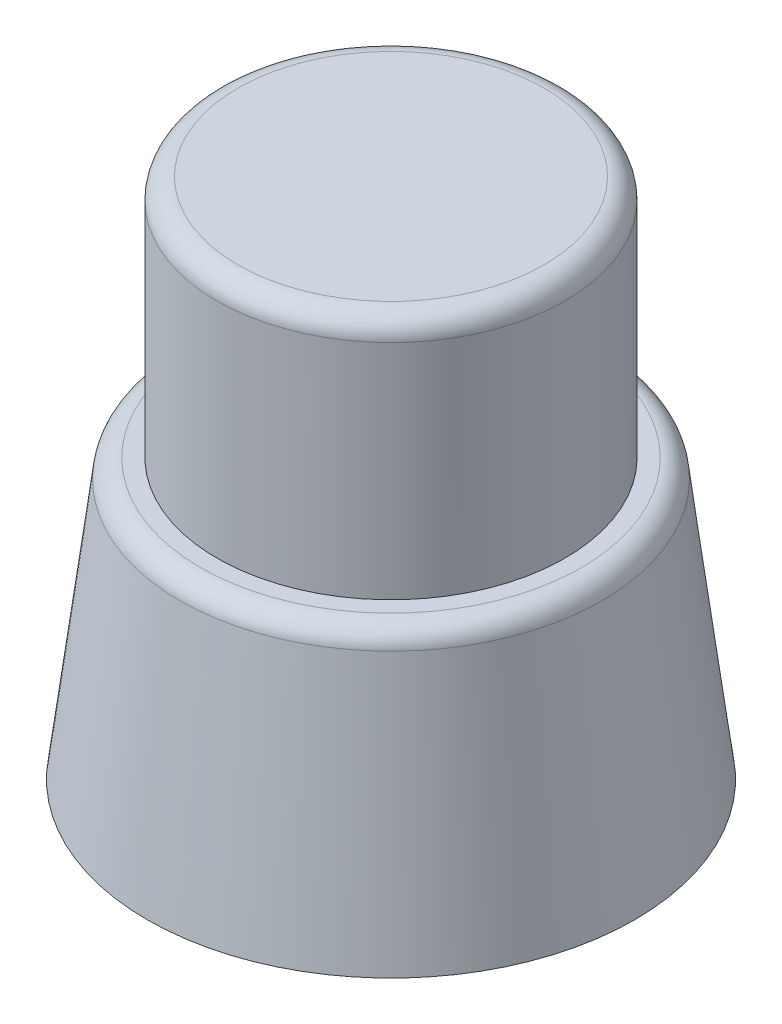
ISO-10303-21;
HEADER;
FILE_DESCRIPTION(('STEP AP214'),'2;1');
FILE_NAME('part.step','',(''),(''),'','','');
FILE_SCHEMA(('AUTOMOTIVE_DESIGN { 1 0 10303 214 1 1 1 1 }'));
ENDSEC;
DATA;
#1=APPLICATION_CONTEXT('core data for automotive mechanical design processes');
#2=APPLICATION_PROTOCOL_DEFINITION('international standard','automotive_design',2000,#1);
#3=PRODUCT_CONTEXT('',#1,'mechanical');
#4=PRODUCT('Part','Part','',(#3));
#5=PRODUCT_RELATED_PRODUCT_CATEGORY('part','',(#4));
#6=PRODUCT_DEFINITION_FORMATION('','',#4);
#7=PRODUCT_DEFINITION_CONTEXT('part definition',#1,'design');
#8=PRODUCT_DEFINITION('design','',#6,#7);
#9=PRODUCT_DEFINITION_SHAPE('','',#8);
#10=(LENGTH_UNIT() NAMED_UNIT(*) SI_UNIT(.MILLI.,.METRE.));
#11=(NAMED_UNIT(*) PLANE_ANGLE_UNIT() SI_UNIT($,.RADIAN.));
#12=(NAMED_UNIT(*) SI_UNIT($,.STERADIAN.) SOLID_ANGLE_UNIT());
#13=UNCERTAINTY_MEASURE_WITH_UNIT(LENGTH_MEASURE(1.E-05),#10,'distance_accuracy_value','');
#14=(GEOMETRIC_REPRESENTATION_CONTEXT(3) GLOBAL_UNCERTAINTY_ASSIGNED_CONTEXT((#13)) GLOBAL_UNIT_ASSIGNED_CONTEXT((#10,
#11,#12)) REPRESENTATION_CONTEXT('',''));
#15=CARTESIAN_POINT('',(0.,0.,0.));
#16=DIRECTION('',(0.,0.,1.));
#17=DIRECTION('',(1.,0.,0.));
#18=AXIS2_PLACEMENT_3D('',#15,#16,#17);
#19=CARTESIAN_POINT('',(0.,75.,0.));
#20=DIRECTION('',(0.,1.,0.));
#21=DIRECTION('',(0.,0.,1.));
#22=AXIS2_PLACEMENT_3D('',#19,#20,#21);
#23=PLANE('',#22);
#24=CARTESIAN_POINT('',(0.,75.,0.));
#25=DIRECTION('',(0.,1.,0.));
#26=DIRECTION('',(0.,0.,1.));
#27=AXIS2_PLACEMENT_3D('',#24,#25,#26);
#28=CIRCLE('',#27,22.);
#29=CARTESIAN_POINT('',(0.,75.,22.));
#30=VERTEX_POINT('',#29);
#31=EDGE_CURVE('E10',#30,#30,#28,.T.);
#32=ORIENTED_EDGE('',*,*,#31,.T.);
#33=EDGE_LOOP('',(#32));
#34=FACE_BOUND('',#33,.T.);
#35=ADVANCED_FACE('F31',(#34),#23,.T.);
#36=CARTESIAN_POINT('',(0.,0.,0.));
#37=DIRECTION('',(0.,-1.,0.));
#38=DIRECTION('',(0.,0.,-1.));
#39=AXIS2_PLACEMENT_3D('',#36,#37,#38);
#40=CYLINDRICAL_SURFACE('',#39,25.);
#41=CARTESIAN_POINT('',(0.,72.,0.));
#42=DIRECTION('',(0.,1.,0.));
#43=DIRECTION('',(0.,0.,1.));
#44=AXIS2_PLACEMENT_3D('',#41,#42,#43);
#45=CIRCLE('',#44,25.);
#46=CARTESIAN_POINT('',(0.,72.,25.));
#47=VERTEX_POINT('',#46);
#48=EDGE_CURVE('E38',#47,#47,#45,.F.);
#49=ORIENTED_EDGE('',*,*,#48,.T.);
#50=EDGE_LOOP('',(#49));
#51=FACE_BOUND('',#50,.T.);
#52=CARTESIAN_POINT('',(0.,40.,0.));
#53=DIRECTION('',(0.,-1.,0.));
#54=DIRECTION('',(0.,0.,-1.));
#55=AXIS2_PLACEMENT_3D('',#52,#53,#54);
#56=CIRCLE('',#55,25.);
#57=CARTESIAN_POINT('',(0.,40.,-25.));
#58=VERTEX_POINT('',#57);
#59=EDGE_CURVE('E51',#58,#58,#56,.T.);
#60=ORIENTED_EDGE('',*,*,#59,.F.);
#61=EDGE_LOOP('',(#60));
#62=FACE_BOUND('',#61,.T.);
#63=ADVANCED_FACE('F93',(#51,#62),#40,.T.);
#64=CARTESIAN_POINT('',(25.,40.,0.));
#65=DIRECTION('',(0.,1.,0.));
#66=DIRECTION('',(0.,0.,1.));
#67=AXIS2_PLACEMENT_3D('',#64,#65,#66);
#68=PLANE('',#67);
#69=CARTESIAN_POINT('',(0.,40.,0.));
#70=DIRECTION('',(0.,1.,0.));
#71=DIRECTION('',(0.,0.,1.));
#72=AXIS2_PLACEMENT_3D('',#69,#70,#71);
#73=CIRCLE('',#72,27.3516533443881);
#74=CARTESIAN_POINT('',(0.,40.,27.3516533443881));
#75=VERTEX_POINT('',#74);
#76=EDGE_CURVE('E42',#75,#75,#73,.T.);
#77=ORIENTED_EDGE('',*,*,#76,.T.);
#78=EDGE_LOOP('',(#77));
#79=FACE_BOUND('',#78,.T.);
#80=ORIENTED_EDGE('',*,*,#59,.T.);
#81=EDGE_LOOP('',(#80));
#82=FACE_BOUND('',#81,.T.);
#83=ADVANCED_FACE('F98',(#79,#82),#68,.T.);
#84=CARTESIAN_POINT('',(0.,0.,0.));
#85=DIRECTION('',(0.,-1.,0.));
#86=DIRECTION('',(0.,0.,-1.));
#87=AXIS2_PLACEMENT_3D('',#84,#85,#86);
#88=CONICAL_SURFACE('',#87,35.,0.124354994546761);
#89=CARTESIAN_POINT('',(0.,37.3721042037676,0.));
#90=DIRECTION('',(0.,1.,0.));
#91=DIRECTION('',(0.,0.,1.));
#92=AXIS2_PLACEMENT_3D('',#89,#90,#91);
#93=CIRCLE('',#92,30.3284869745291);
#94=CARTESIAN_POINT('',(0.,37.3721042037676,30.3284869745291));
#95=VERTEX_POINT('',#94);
#96=EDGE_CURVE('E46',#95,#95,#93,.F.);
#97=ORIENTED_EDGE('',*,*,#96,.T.);
#98=EDGE_LOOP('',(#97));
#99=FACE_BOUND('',#98,.T.);
#100=CARTESIAN_POINT('',(0.,0.,0.));
#101=DIRECTION('',(0.,-1.,0.));
#102=DIRECTION('',(0.,0.,-1.));
#103=AXIS2_PLACEMENT_3D('',#100,#101,#102);
#104=CIRCLE('',#103,35.);
#105=CARTESIAN_POINT('',(0.,0.,-35.));
#106=VERTEX_POINT('',#105);
#107=EDGE_CURVE('E54',#106,#106,#104,.T.);
#108=ORIENTED_EDGE('',*,*,#107,.F.);
#109=EDGE_LOOP('',(#108));
#110=FACE_BOUND('',#109,.T.);
#111=ADVANCED_FACE('F107',(#99,#110),#88,.T.);
#112=CARTESIAN_POINT('',(35.,0.,0.));
#113=DIRECTION('',(0.,-1.,0.));
#114=DIRECTION('',(0.,0.,-1.));
#115=AXIS2_PLACEMENT_3D('',#112,#113,#114);
#116=PLANE('',#115);
#117=CARTESIAN_POINT('',(0.,0.,0.));
#118=DIRECTION('',(0.,-1.,0.));
#119=DIRECTION('',(0.,0.,-1.));
#120=AXIS2_PLACEMENT_3D('',#117,#118,#119);
#121=CIRCLE('',#120,32.9844355629254);
#122=CARTESIAN_POINT('',(0.,0.,-32.9844355629254));
#123=VERTEX_POINT('',#122);
#124=EDGE_CURVE('E58',#123,#123,#121,.T.);
#125=ORIENTED_EDGE('',*,*,#124,.F.);
#126=EDGE_LOOP('',(#125));
#127=FACE_BOUND('',#126,.T.);
#128=ORIENTED_EDGE('',*,*,#107,.T.);
#129=EDGE_LOOP('',(#128));
#130=FACE_BOUND('',#129,.T.);
#131=ADVANCED_FACE('F102',(#127,#130),#116,.T.);
#132=CARTESIAN_POINT('',(0.,37.,0.));
#133=DIRECTION('',(0.,1.,0.));
#134=DIRECTION('',(0.,0.,1.));
#135=AXIS2_PLACEMENT_3D('',#132,#133,#134);
#136=TOROIDAL_SURFACE('',#135,27.3516533443881,3.);
#137=ORIENTED_EDGE('',*,*,#76,.F.);
#138=EDGE_LOOP('',(#137));
#139=FACE_BOUND('',#138,.T.);
#140=ORIENTED_EDGE('',*,*,#96,.F.);
#141=EDGE_LOOP('',(#140));
#142=FACE_BOUND('',#141,.T.);
#143=ADVANCED_FACE('F90',(#139,#142),#136,.T.);
#144=CARTESIAN_POINT('',(0.,72.,0.));
#145=DIRECTION('',(0.,1.,0.));
#146=DIRECTION('',(0.,0.,1.));
#147=AXIS2_PLACEMENT_3D('',#144,#145,#146);
#148=TOROIDAL_SURFACE('',#147,22.,3.);
#149=ORIENTED_EDGE('',*,*,#31,.F.);
#150=EDGE_LOOP('',(#149));
#151=FACE_BOUND('',#150,.T.);
#152=ORIENTED_EDGE('',*,*,#48,.F.);
#153=EDGE_LOOP('',(#152));
#154=FACE_BOUND('',#153,.T.);
#155=ADVANCED_FACE('F33',(#151,#154),#148,.T.);
#156=CARTESIAN_POINT('',(0.,73.,0.));
#157=DIRECTION('',(0.,1.,0.));
#158=DIRECTION('',(0.,0.,1.));
#159=AXIS2_PLACEMENT_3D('',#156,#157,#158);
#160=PLANE('',#159);
#161=CARTESIAN_POINT('',(0.,73.,0.));
#162=DIRECTION('',(0.,1.,0.));
#163=DIRECTION('',(0.,0.,1.));
#164=AXIS2_PLACEMENT_3D('',#161,#162,#163);
#165=CIRCLE('',#164,22.);
#166=CARTESIAN_POINT('',(0.,73.,22.));
#167=VERTEX_POINT('',#166);
#168=EDGE_CURVE('E57',#167,#167,#165,.T.);
#169=ORIENTED_EDGE('',*,*,#168,.F.);
#170=EDGE_LOOP('',(#169));
#171=FACE_BOUND('',#170,.T.);
#172=ADVANCED_FACE('F79',(#171),#160,.F.);
#173=CARTESIAN_POINT('',(0.,0.,0.));
#174=DIRECTION('',(0.,-1.,0.));
#175=DIRECTION('',(0.,0.,-1.));
#176=AXIS2_PLACEMENT_3D('',#173,#174,#175);
#177=CYLINDRICAL_SURFACE('',#176,23.);
#178=CARTESIAN_POINT('',(0.,72.,0.));
#179=DIRECTION('',(0.,-1.,0.));
#180=DIRECTION('',(0.,0.,-1.));
#181=AXIS2_PLACEMENT_3D('',#178,#179,#180);
#182=CIRCLE('',#181,23.);
#183=CARTESIAN_POINT('',(0.,72.,-23.));
#184=VERTEX_POINT('',#183);
#185=EDGE_CURVE('E68',#184,#184,#182,.T.);
#186=ORIENTED_EDGE('',*,*,#185,.F.);
#187=EDGE_LOOP('',(#186));
#188=FACE_BOUND('',#187,.T.);
#189=CARTESIAN_POINT('',(0.,38.,0.));
#190=DIRECTION('',(0.,1.,0.));
#191=DIRECTION('',(0.,0.,1.));
#192=AXIS2_PLACEMENT_3D('',#189,#190,#191);
#193=CIRCLE('',#192,23.);
#194=CARTESIAN_POINT('',(0.,38.,23.));
#195=VERTEX_POINT('',#194);
#196=EDGE_CURVE('E61',#195,#195,#193,.F.);
#197=ORIENTED_EDGE('',*,*,#196,.T.);
#198=EDGE_LOOP('',(#197));
#199=FACE_BOUND('',#198,.T.);
#200=ADVANCED_FACE('F81',(#188,#199),#177,.F.);
#201=CARTESIAN_POINT('',(25.,38.,0.));
#202=DIRECTION('',(0.,1.,0.));
#203=DIRECTION('',(0.,0.,1.));
#204=AXIS2_PLACEMENT_3D('',#201,#202,#203);
#205=PLANE('',#204);
#206=CARTESIAN_POINT('',(0.,38.,0.));
#207=DIRECTION('',(0.,1.,0.));
#208=DIRECTION('',(0.,0.,1.));
#209=AXIS2_PLACEMENT_3D('',#206,#207,#208);
#210=CIRCLE('',#209,27.3516533443881);
#211=CARTESIAN_POINT('',(0.,38.,27.3516533443881));
#212=VERTEX_POINT('',#211);
#213=EDGE_CURVE('E65',#212,#212,#210,.T.);
#214=ORIENTED_EDGE('',*,*,#213,.F.);
#215=EDGE_LOOP('',(#214));
#216=FACE_BOUND('',#215,.T.);
#217=ORIENTED_EDGE('',*,*,#196,.F.);
#218=EDGE_LOOP('',(#217));
#219=FACE_BOUND('',#218,.T.);
#220=ADVANCED_FACE('F87',(#216,#219),#205,.F.);
#221=CARTESIAN_POINT('',(0.,-0.248069469178419,0.));
#222=DIRECTION('',(0.,-1.,0.));
#223=DIRECTION('',(0.,0.,-1.));
#224=AXIS2_PLACEMENT_3D('',#221,#222,#223);
#225=CONICAL_SURFACE('',#224,33.0154442465727,0.124354994546761);
#226=CARTESIAN_POINT('',(0.,37.1240347345892,0.));
#227=DIRECTION('',(0.,-1.,0.));
#228=DIRECTION('',(0.,0.,-1.));
#229=AXIS2_PLACEMENT_3D('',#226,#227,#228);
#230=CIRCLE('',#229,28.3439312211017);
#231=CARTESIAN_POINT('',(0.,37.1240347345892,-28.3439312211017));
#232=VERTEX_POINT('',#231);
#233=EDGE_CURVE('E62',#232,#232,#230,.T.);
#234=ORIENTED_EDGE('',*,*,#233,.F.);
#235=EDGE_LOOP('',(#234));
#236=FACE_BOUND('',#235,.T.);
#237=ORIENTED_EDGE('',*,*,#124,.T.);
#238=EDGE_LOOP('',(#237));
#239=FACE_BOUND('',#238,.T.);
#240=ADVANCED_FACE('F129',(#236,#239),#225,.F.);
#241=CARTESIAN_POINT('',(0.,37.,0.));
#242=DIRECTION('',(0.,1.,0.));
#243=DIRECTION('',(0.,0.,1.));
#244=AXIS2_PLACEMENT_3D('',#241,#242,#243);
#245=TOROIDAL_SURFACE('',#244,27.3516533443881,1.);
#246=ORIENTED_EDGE('',*,*,#213,.T.);
#247=EDGE_LOOP('',(#246));
#248=FACE_BOUND('',#247,.T.);
#249=ORIENTED_EDGE('',*,*,#233,.T.);
#250=EDGE_LOOP('',(#249));
#251=FACE_BOUND('',#250,.T.);
#252=ADVANCED_FACE('F126',(#248,#251),#245,.F.);
#253=CARTESIAN_POINT('',(0.,72.,0.));
#254=DIRECTION('',(0.,1.,0.));
#255=DIRECTION('',(0.,0.,1.));
#256=AXIS2_PLACEMENT_3D('',#253,#254,#255);
#257=TOROIDAL_SURFACE('',#256,22.,1.);
#258=ORIENTED_EDGE('',*,*,#168,.T.);
#259=EDGE_LOOP('',(#258));
#260=FACE_BOUND('',#259,.T.);
#261=ORIENTED_EDGE('',*,*,#185,.T.);
#262=EDGE_LOOP('',(#261));
#263=FACE_BOUND('',#262,.T.);
#264=ADVANCED_FACE('F76',(#260,#263),#257,.F.);
#265=CLOSED_SHELL('',(#35,#63,#83,#111,#131,#143,#155,#172,#200,#220,#240,#252,#264));
#266=MANIFOLD_SOLID_BREP('B2',#265);
#267=ADVANCED_BREP_SHAPE_REPRESENTATION('',(#18,#266),#14);
#268=SHAPE_DEFINITION_REPRESENTATION(#9,#267);
ENDSEC;
END-ISO-10303-21;
